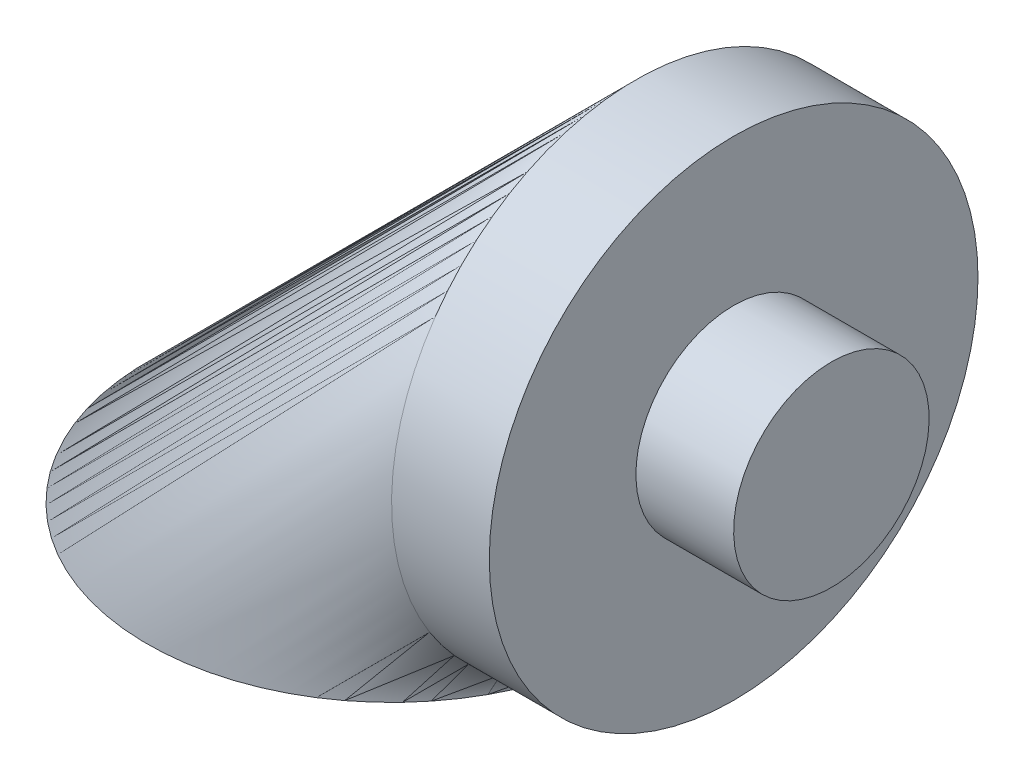
ISO-10303-21;
HEADER;
FILE_DESCRIPTION(('STEP AP214'),'2;1');
FILE_NAME('part.step','',(''),(''),'','','');
FILE_SCHEMA(('AUTOMOTIVE_DESIGN { 1 0 10303 214 1 1 1 1 }'));
ENDSEC;
DATA;
#1=APPLICATION_CONTEXT('core data for automotive mechanical design processes');
#2=APPLICATION_PROTOCOL_DEFINITION('international standard','automotive_design',2000,#1);
#3=PRODUCT_CONTEXT('',#1,'mechanical');
#4=PRODUCT('Part','Part','',(#3));
#5=PRODUCT_RELATED_PRODUCT_CATEGORY('part','',(#4));
#6=PRODUCT_DEFINITION_FORMATION('','',#4);
#7=PRODUCT_DEFINITION_CONTEXT('part definition',#1,'design');
#8=PRODUCT_DEFINITION('design','',#6,#7);
#9=PRODUCT_DEFINITION_SHAPE('','',#8);
#10=(LENGTH_UNIT() NAMED_UNIT(*) SI_UNIT(.MILLI.,.METRE.));
#11=(NAMED_UNIT(*) PLANE_ANGLE_UNIT() SI_UNIT($,.RADIAN.));
#12=(NAMED_UNIT(*) SI_UNIT($,.STERADIAN.) SOLID_ANGLE_UNIT());
#13=UNCERTAINTY_MEASURE_WITH_UNIT(LENGTH_MEASURE(1.E-05),#10,'distance_accuracy_value','');
#14=(GEOMETRIC_REPRESENTATION_CONTEXT(3) GLOBAL_UNCERTAINTY_ASSIGNED_CONTEXT((#13)) GLOBAL_UNIT_ASSIGNED_CONTEXT((#10,
#11,#12)) REPRESENTATION_CONTEXT('',''));
#15=CARTESIAN_POINT('',(0.,0.,0.));
#16=DIRECTION('',(0.,0.,1.));
#17=DIRECTION('',(1.,0.,0.));
#18=AXIS2_PLACEMENT_3D('',#15,#16,#17);
#19=CARTESIAN_POINT('',(0.,0.,0.));
#20=DIRECTION('',(0.,1.,0.));
#21=DIRECTION('',(0.,0.,1.));
#22=AXIS2_PLACEMENT_3D('',#19,#20,#21);
#23=PLANE('',#22);
#24=CARTESIAN_POINT('',(0.,0.,0.));
#25=DIRECTION('',(0.,-1.,0.));
#26=DIRECTION('',(0.,0.,-1.));
#27=AXIS2_PLACEMENT_3D('',#24,#25,#26);
#28=CIRCLE('',#27,20.);
#29=CARTESIAN_POINT('',(0.,0.,-20.));
#30=VERTEX_POINT('',#29);
#31=EDGE_CURVE('E42',#30,#30,#28,.T.);
#32=ORIENTED_EDGE('',*,*,#31,.F.);
#33=EDGE_LOOP('',(#32));
#34=FACE_BOUND('',#33,.T.);
#35=CARTESIAN_POINT('',(0.,0.,0.));
#36=DIRECTION('',(0.,1.,0.));
#37=DIRECTION('',(0.,0.,1.));
#38=AXIS2_PLACEMENT_3D('',#35,#36,#37);
#39=CIRCLE('',#38,50.);
#40=CARTESIAN_POINT('',(50.,0.,0.));
#41=VERTEX_POINT('',#40);
#42=EDGE_CURVE('E47',#41,#41,#39,.T.);
#43=ORIENTED_EDGE('',*,*,#42,.F.);
#44=EDGE_LOOP('',(#43));
#45=FACE_BOUND('',#44,.T.);
#46=ADVANCED_FACE('F35',(#34,#45),#23,.F.);
#47=CARTESIAN_POINT('',(50.,0.,0.));
#48=DIRECTION('',(0.,0.,1.));
#49=DIRECTION('',(1.,0.,0.));
#50=AXIS2_PLACEMENT_3D('',#47,#48,#49);
#51=DEGENERATE_TOROIDAL_SURFACE('',#50,50.,50.,.T.);
#52=ORIENTED_EDGE('',*,*,#42,.T.);
#53=CARTESIAN_POINT('',(50.,50.,0.));
#54=DIRECTION('',(1.,0.,0.));
#55=DIRECTION('',(0.,0.,1.));
#56=AXIS2_PLACEMENT_3D('',#53,#54,#55);
#57=CIRCLE('',#56,50.);
#58=EDGE_CURVE('E50',#41,#41,#57,.T.);
#59=ORIENTED_EDGE('',*,*,#58,.F.);
#60=EDGE_LOOP('',(#52,#59));
#61=FACE_BOUND('',#60,.T.);
#62=ADVANCED_FACE('F87',(#61),#51,.T.);
#63=CARTESIAN_POINT('',(0.,-20.,0.));
#64=DIRECTION('',(0.,1.,0.));
#65=DIRECTION('',(0.,0.,1.));
#66=AXIS2_PLACEMENT_3D('',#63,#64,#65);
#67=CYLINDRICAL_SURFACE('',#66,20.);
#68=CARTESIAN_POINT('',(0.,-20.,0.));
#69=DIRECTION('',(0.,-1.,0.));
#70=DIRECTION('',(0.,0.,-1.));
#71=AXIS2_PLACEMENT_3D('',#68,#69,#70);
#72=CIRCLE('',#71,20.);
#73=CARTESIAN_POINT('',(0.,-20.,-20.));
#74=VERTEX_POINT('',#73);
#75=EDGE_CURVE('E54',#74,#74,#72,.T.);
#76=ORIENTED_EDGE('',*,*,#75,.F.);
#77=EDGE_LOOP('',(#76));
#78=FACE_BOUND('',#77,.T.);
#79=ORIENTED_EDGE('',*,*,#31,.T.);
#80=EDGE_LOOP('',(#79));
#81=FACE_BOUND('',#80,.T.);
#82=ADVANCED_FACE('F89',(#78,#81),#67,.T.);
#83=CARTESIAN_POINT('',(0.,-20.,0.));
#84=DIRECTION('',(0.,-1.,0.));
#85=DIRECTION('',(0.,0.,-1.));
#86=AXIS2_PLACEMENT_3D('',#83,#84,#85);
#87=PLANE('',#86);
#88=ORIENTED_EDGE('',*,*,#75,.T.);
#89=EDGE_LOOP('',(#88));
#90=FACE_BOUND('',#89,.T.);
#91=ADVANCED_FACE('F85',(#90),#87,.T.);
#92=CARTESIAN_POINT('',(70.,50.,0.));
#93=DIRECTION('',(-1.,0.,0.));
#94=DIRECTION('',(0.,-1.,0.));
#95=AXIS2_PLACEMENT_3D('',#92,#93,#94);
#96=CYLINDRICAL_SURFACE('',#95,50.);
#97=CARTESIAN_POINT('',(70.,50.,0.));
#98=DIRECTION('',(1.,0.,0.));
#99=DIRECTION('',(0.,1.,0.));
#100=AXIS2_PLACEMENT_3D('',#97,#98,#99);
#101=CIRCLE('',#100,50.);
#102=CARTESIAN_POINT('',(70.,100.,0.));
#103=VERTEX_POINT('',#102);
#104=EDGE_CURVE('E61',#103,#103,#101,.T.);
#105=ORIENTED_EDGE('',*,*,#104,.F.);
#106=EDGE_LOOP('',(#105));
#107=FACE_BOUND('',#106,.T.);
#108=ORIENTED_EDGE('',*,*,#58,.T.);
#109=EDGE_LOOP('',(#108));
#110=FACE_BOUND('',#109,.T.);
#111=ADVANCED_FACE('F79',(#107,#110),#96,.T.);
#112=CARTESIAN_POINT('',(70.,50.,0.));
#113=DIRECTION('',(1.,0.,0.));
#114=DIRECTION('',(0.,1.,0.));
#115=AXIS2_PLACEMENT_3D('',#112,#113,#114);
#116=PLANE('',#115);
#117=CARTESIAN_POINT('',(70.,50.,0.));
#118=DIRECTION('',(1.,0.,0.));
#119=DIRECTION('',(0.,1.,0.));
#120=AXIS2_PLACEMENT_3D('',#117,#118,#119);
#121=CIRCLE('',#120,20.);
#122=CARTESIAN_POINT('',(70.,70.,0.));
#123=VERTEX_POINT('',#122);
#124=EDGE_CURVE('E11',#123,#123,#121,.T.);
#125=ORIENTED_EDGE('',*,*,#124,.F.);
#126=EDGE_LOOP('',(#125));
#127=FACE_BOUND('',#126,.T.);
#128=ORIENTED_EDGE('',*,*,#104,.T.);
#129=EDGE_LOOP('',(#128));
#130=FACE_BOUND('',#129,.T.);
#131=ADVANCED_FACE('F73',(#127,#130),#116,.T.);
#132=CARTESIAN_POINT('',(90.,50.,0.));
#133=DIRECTION('',(-1.,0.,0.));
#134=DIRECTION('',(0.,-1.,0.));
#135=AXIS2_PLACEMENT_3D('',#132,#133,#134);
#136=CYLINDRICAL_SURFACE('',#135,20.);
#137=CARTESIAN_POINT('',(90.,50.,0.));
#138=DIRECTION('',(1.,0.,0.));
#139=DIRECTION('',(0.,1.,0.));
#140=AXIS2_PLACEMENT_3D('',#137,#138,#139);
#141=CIRCLE('',#140,20.);
#142=CARTESIAN_POINT('',(90.,70.,0.));
#143=VERTEX_POINT('',#142);
#144=EDGE_CURVE('E63',#143,#143,#141,.T.);
#145=ORIENTED_EDGE('',*,*,#144,.F.);
#146=EDGE_LOOP('',(#145));
#147=FACE_BOUND('',#146,.T.);
#148=ORIENTED_EDGE('',*,*,#124,.T.);
#149=EDGE_LOOP('',(#148));
#150=FACE_BOUND('',#149,.T.);
#151=ADVANCED_FACE('F70',(#147,#150),#136,.T.);
#152=CARTESIAN_POINT('',(90.,50.,0.));
#153=DIRECTION('',(1.,0.,0.));
#154=DIRECTION('',(0.,1.,0.));
#155=AXIS2_PLACEMENT_3D('',#152,#153,#154);
#156=PLANE('',#155);
#157=ORIENTED_EDGE('',*,*,#144,.T.);
#158=EDGE_LOOP('',(#157));
#159=FACE_BOUND('',#158,.T.);
#160=ADVANCED_FACE('F68',(#159),#156,.T.);
#161=CLOSED_SHELL('',(#46,#62,#82,#91,#111,#131,#151,#160));
#162=MANIFOLD_SOLID_BREP('B2',#161);
#163=ADVANCED_BREP_SHAPE_REPRESENTATION('',(#18,#162),#14);
#164=SHAPE_DEFINITION_REPRESENTATION(#9,#163);
ENDSEC;
END-ISO-10303-21;
